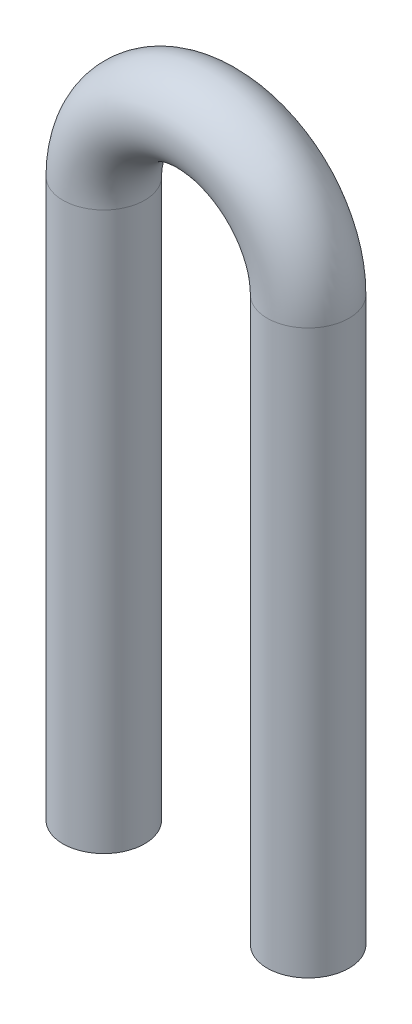
ISO-10303-21;
HEADER;
FILE_DESCRIPTION(('STEP AP214'),'2;1');
FILE_NAME('part.step','',(''),(''),'','','');
FILE_SCHEMA(('AUTOMOTIVE_DESIGN { 1 0 10303 214 1 1 1 1 }'));
ENDSEC;
DATA;
#1=APPLICATION_CONTEXT('core data for automotive mechanical design processes');
#2=APPLICATION_PROTOCOL_DEFINITION('international standard','automotive_design',2000,#1);
#3=PRODUCT_CONTEXT('',#1,'mechanical');
#4=PRODUCT('Part','Part','',(#3));
#5=PRODUCT_RELATED_PRODUCT_CATEGORY('part','',(#4));
#6=PRODUCT_DEFINITION_FORMATION('','',#4);
#7=PRODUCT_DEFINITION_CONTEXT('part definition',#1,'design');
#8=PRODUCT_DEFINITION('design','',#6,#7);
#9=PRODUCT_DEFINITION_SHAPE('','',#8);
#10=(LENGTH_UNIT() NAMED_UNIT(*) SI_UNIT(.MILLI.,.METRE.));
#11=(NAMED_UNIT(*) PLANE_ANGLE_UNIT() SI_UNIT($,.RADIAN.));
#12=(NAMED_UNIT(*) SI_UNIT($,.STERADIAN.) SOLID_ANGLE_UNIT());
#13=UNCERTAINTY_MEASURE_WITH_UNIT(LENGTH_MEASURE(1.E-05),#10,'distance_accuracy_value','');
#14=(GEOMETRIC_REPRESENTATION_CONTEXT(3) GLOBAL_UNCERTAINTY_ASSIGNED_CONTEXT((#13)) GLOBAL_UNIT_ASSIGNED_CONTEXT((#10,
#11,#12)) REPRESENTATION_CONTEXT('',''));
#15=CARTESIAN_POINT('',(0.,0.,0.));
#16=DIRECTION('',(0.,0.,1.));
#17=DIRECTION('',(1.,0.,0.));
#18=AXIS2_PLACEMENT_3D('',#15,#16,#17);
#19=CARTESIAN_POINT('',(5.,-27.5423728813559,0.));
#20=DIRECTION('',(0.,-1.,0.));
#21=DIRECTION('',(0.,0.,1.));
#22=AXIS2_PLACEMENT_3D('',#19,#20,#21);
#23=PLANE('',#22);
#24=CARTESIAN_POINT('',(5.,-27.5423728813559,0.));
#25=DIRECTION('',(0.,-1.,0.));
#26=DIRECTION('',(0.,0.,1.));
#27=AXIS2_PLACEMENT_3D('',#24,#25,#26);
#28=CIRCLE('',#27,4.);
#29=CARTESIAN_POINT('',(5.,-27.5423728813559,4.));
#30=VERTEX_POINT('',#29);
#31=EDGE_CURVE('E49',#30,#30,#28,.T.);
#32=ORIENTED_EDGE('',*,*,#31,.T.);
#33=EDGE_LOOP('',(#32));
#34=FACE_BOUND('',#33,.T.);
#35=ADVANCED_FACE('F37',(#34),#23,.T.);
#36=CARTESIAN_POINT('',(5.,-27.5423728813559,0.));
#37=DIRECTION('',(0.,1.,0.));
#38=DIRECTION('',(0.,0.,1.));
#39=AXIS2_PLACEMENT_3D('',#36,#37,#38);
#40=CYLINDRICAL_SURFACE('',#39,4.);
#41=CARTESIAN_POINT('',(5.,27.5423728813559,0.));
#42=DIRECTION('',(0.,-1.,0.));
#43=DIRECTION('',(0.,0.,1.));
#44=AXIS2_PLACEMENT_3D('',#41,#42,#43);
#45=CIRCLE('',#44,4.);
#46=CARTESIAN_POINT('',(9.,27.5423728813559,0.));
#47=VERTEX_POINT('',#46);
#48=EDGE_CURVE('E44',#47,#47,#45,.T.);
#49=ORIENTED_EDGE('',*,*,#48,.T.);
#50=EDGE_LOOP('',(#49));
#51=FACE_BOUND('',#50,.T.);
#52=ORIENTED_EDGE('',*,*,#31,.F.);
#53=EDGE_LOOP('',(#52));
#54=FACE_BOUND('',#53,.T.);
#55=ADVANCED_FACE('F73',(#51,#54),#40,.T.);
#56=CARTESIAN_POINT('',(-5.,27.5423728813559,0.));
#57=DIRECTION('',(0.,0.,1.));
#58=DIRECTION('',(1.,0.,0.));
#59=AXIS2_PLACEMENT_3D('',#56,#57,#58);
#60=TOROIDAL_SURFACE('',#59,10.,4.);
#61=CARTESIAN_POINT('',(-15.,27.5423728813559,0.));
#62=DIRECTION('',(0.,1.,0.));
#63=DIRECTION('',(0.,0.,1.));
#64=AXIS2_PLACEMENT_3D('',#61,#62,#63);
#65=CIRCLE('',#64,4.);
#66=CARTESIAN_POINT('',(-19.,27.5423728813559,0.));
#67=VERTEX_POINT('',#66);
#68=EDGE_CURVE('E10',#67,#67,#65,.T.);
#69=CARTESIAN_POINT('',(-5.,27.5423728813559,0.));
#70=DIRECTION('',(0.,0.,1.));
#71=DIRECTION('',(1.,0.,0.));
#72=AXIS2_PLACEMENT_3D('',#69,#70,#71);
#73=CIRCLE('',#72,14.);
#74=EDGE_CURVE('',#47,#67,#73,.T.);
#75=ORIENTED_EDGE('',*,*,#48,.F.);
#76=ORIENTED_EDGE('',*,*,#68,.T.);
#77=ORIENTED_EDGE('',*,*,#74,.T.);
#78=ORIENTED_EDGE('',*,*,#74,.F.);
#79=EDGE_LOOP('',(#75,#77,#76,#78));
#80=FACE_BOUND('',#79,.T.);
#81=ADVANCED_FACE('F69',(#80),#60,.T.);
#82=CARTESIAN_POINT('',(-15.,27.5423728813559,0.));
#83=DIRECTION('',(0.,-1.,0.));
#84=DIRECTION('',(0.,0.,-1.));
#85=AXIS2_PLACEMENT_3D('',#82,#83,#84);
#86=CYLINDRICAL_SURFACE('',#85,4.);
#87=ORIENTED_EDGE('',*,*,#68,.F.);
#88=EDGE_LOOP('',(#87));
#89=FACE_BOUND('',#88,.T.);
#90=CARTESIAN_POINT('',(-15.,-27.,0.));
#91=DIRECTION('',(0.,1.,0.));
#92=DIRECTION('',(0.,0.,1.));
#93=AXIS2_PLACEMENT_3D('',#90,#91,#92);
#94=CIRCLE('',#93,4.);
#95=CARTESIAN_POINT('',(-15.,-27.,4.));
#96=VERTEX_POINT('',#95);
#97=EDGE_CURVE('E54',#96,#96,#94,.T.);
#98=ORIENTED_EDGE('',*,*,#97,.T.);
#99=EDGE_LOOP('',(#98));
#100=FACE_BOUND('',#99,.T.);
#101=ADVANCED_FACE('F61',(#89,#100),#86,.T.);
#102=CARTESIAN_POINT('',(-15.,-27.,0.));
#103=DIRECTION('',(0.,1.,0.));
#104=DIRECTION('',(0.,0.,1.));
#105=AXIS2_PLACEMENT_3D('',#102,#103,#104);
#106=PLANE('',#105);
#107=ORIENTED_EDGE('',*,*,#97,.F.);
#108=EDGE_LOOP('',(#107));
#109=FACE_BOUND('',#108,.T.);
#110=ADVANCED_FACE('F63',(#109),#106,.F.);
#111=CLOSED_SHELL('',(#35,#55,#81,#101,#110));
#112=MANIFOLD_SOLID_BREP('B2',#111);
#113=ADVANCED_BREP_SHAPE_REPRESENTATION('',(#18,#112),#14);
#114=SHAPE_DEFINITION_REPRESENTATION(#9,#113);
ENDSEC;
END-ISO-10303-21;
